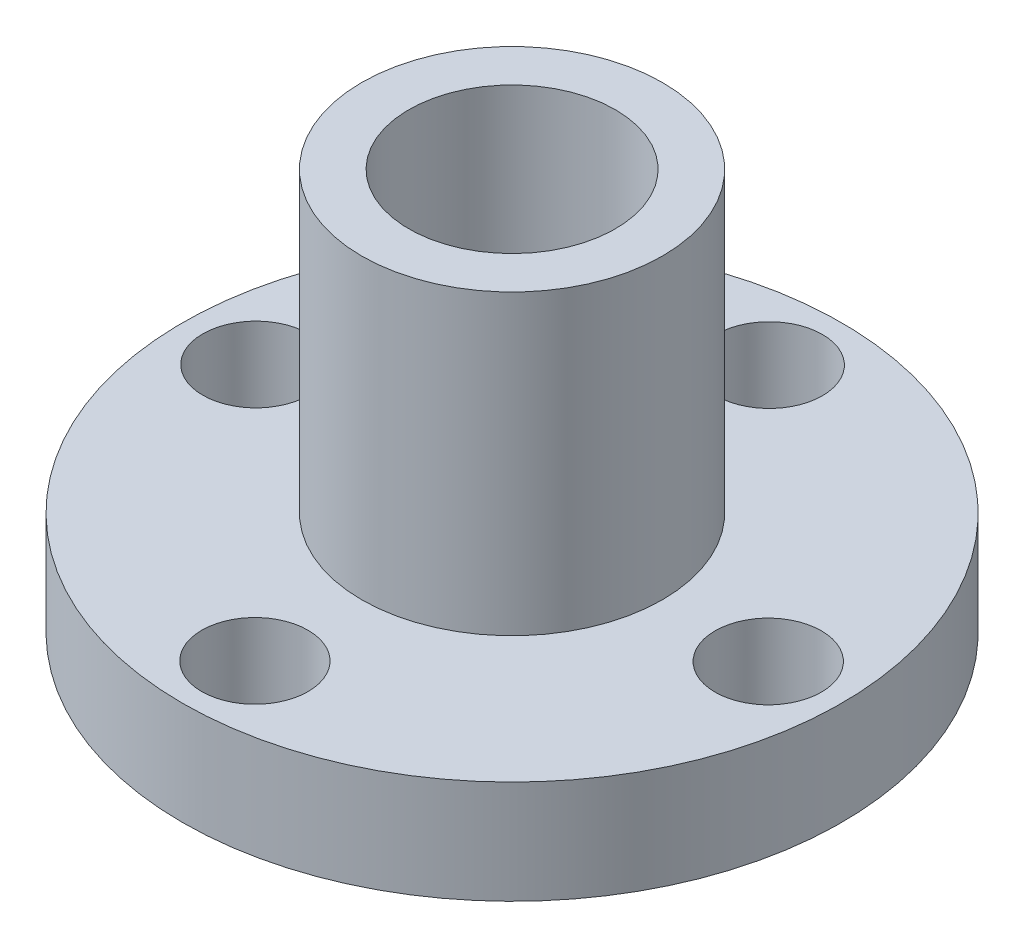
ISO-10303-21;
HEADER;
FILE_DESCRIPTION(('STEP AP214'),'2;1');
FILE_NAME('part.step','',(''),(''),'','','');
FILE_SCHEMA(('AUTOMOTIVE_DESIGN { 1 0 10303 214 1 1 1 1 }'));
ENDSEC;
DATA;
#1=APPLICATION_CONTEXT('core data for automotive mechanical design processes');
#2=APPLICATION_PROTOCOL_DEFINITION('international standard','automotive_design',2000,#1);
#3=PRODUCT_CONTEXT('',#1,'mechanical');
#4=PRODUCT('Part','Part','',(#3));
#5=PRODUCT_RELATED_PRODUCT_CATEGORY('part','',(#4));
#6=PRODUCT_DEFINITION_FORMATION('','',#4);
#7=PRODUCT_DEFINITION_CONTEXT('part definition',#1,'design');
#8=PRODUCT_DEFINITION('design','',#6,#7);
#9=PRODUCT_DEFINITION_SHAPE('','',#8);
#10=(LENGTH_UNIT() NAMED_UNIT(*) SI_UNIT(.MILLI.,.METRE.));
#11=(NAMED_UNIT(*) PLANE_ANGLE_UNIT() SI_UNIT($,.RADIAN.));
#12=(NAMED_UNIT(*) SI_UNIT($,.STERADIAN.) SOLID_ANGLE_UNIT());
#13=UNCERTAINTY_MEASURE_WITH_UNIT(LENGTH_MEASURE(1.E-05),#10,'distance_accuracy_value','');
#14=(GEOMETRIC_REPRESENTATION_CONTEXT(3) GLOBAL_UNCERTAINTY_ASSIGNED_CONTEXT((#13)) GLOBAL_UNIT_ASSIGNED_CONTEXT((#10,
#11,#12)) REPRESENTATION_CONTEXT('',''));
#15=CARTESIAN_POINT('',(0.,0.,0.));
#16=DIRECTION('',(0.,0.,1.));
#17=DIRECTION('',(1.,0.,0.));
#18=AXIS2_PLACEMENT_3D('',#15,#16,#17);
#19=CARTESIAN_POINT('',(0.,14.7,0.));
#20=DIRECTION('',(0.,1.,0.));
#21=DIRECTION('',(0.,0.,1.));
#22=AXIS2_PLACEMENT_3D('',#19,#20,#21);
#23=PLANE('',#22);
#24=CARTESIAN_POINT('',(0.,14.7,0.));
#25=DIRECTION('',(0.,1.,0.));
#26=DIRECTION('',(0.,0.,1.));
#27=AXIS2_PLACEMENT_3D('',#24,#25,#26);
#28=CIRCLE('',#27,4.95);
#29=CARTESIAN_POINT('',(0.,14.7,4.95));
#30=VERTEX_POINT('',#29);
#31=EDGE_CURVE('E62',#30,#30,#28,.T.);
#32=ORIENTED_EDGE('',*,*,#31,.T.);
#33=EDGE_LOOP('',(#32));
#34=FACE_BOUND('',#33,.T.);
#35=CARTESIAN_POINT('',(0.,14.7,0.));
#36=DIRECTION('',(0.,-1.,0.));
#37=DIRECTION('',(0.,0.,-1.));
#38=AXIS2_PLACEMENT_3D('',#35,#36,#37);
#39=CIRCLE('',#38,3.4);
#40=CARTESIAN_POINT('',(0.,14.7,-3.4));
#41=VERTEX_POINT('',#40);
#42=EDGE_CURVE('E75',#41,#41,#39,.T.);
#43=ORIENTED_EDGE('',*,*,#42,.T.);
#44=EDGE_LOOP('',(#43));
#45=FACE_BOUND('',#44,.T.);
#46=ADVANCED_FACE('F45',(#34,#45),#23,.T.);
#47=CARTESIAN_POINT('',(0.,1.5,0.));
#48=DIRECTION('',(0.,-1.,0.));
#49=DIRECTION('',(0.,0.,-1.));
#50=AXIS2_PLACEMENT_3D('',#47,#48,#49);
#51=CYLINDRICAL_SURFACE('',#50,5.);
#52=CARTESIAN_POINT('',(0.,1.5,0.));
#53=DIRECTION('',(0.,1.,0.));
#54=DIRECTION('',(0.,0.,1.));
#55=AXIS2_PLACEMENT_3D('',#52,#53,#54);
#56=CIRCLE('',#55,5.);
#57=CARTESIAN_POINT('',(0.,1.5,5.));
#58=VERTEX_POINT('',#57);
#59=EDGE_CURVE('E54',#58,#58,#56,.T.);
#60=ORIENTED_EDGE('',*,*,#59,.F.);
#61=EDGE_LOOP('',(#60));
#62=FACE_BOUND('',#61,.T.);
#63=CARTESIAN_POINT('',(0.,0.,0.));
#64=DIRECTION('',(0.,1.,0.));
#65=DIRECTION('',(0.,0.,1.));
#66=AXIS2_PLACEMENT_3D('',#63,#64,#65);
#67=CIRCLE('',#66,5.);
#68=CARTESIAN_POINT('',(0.,0.,5.));
#69=VERTEX_POINT('',#68);
#70=EDGE_CURVE('E49',#69,#69,#67,.T.);
#71=ORIENTED_EDGE('',*,*,#70,.T.);
#72=EDGE_LOOP('',(#71));
#73=FACE_BOUND('',#72,.T.);
#74=ADVANCED_FACE('F47',(#62,#73),#51,.T.);
#75=CARTESIAN_POINT('',(0.,0.,0.));
#76=DIRECTION('',(0.,1.,0.));
#77=DIRECTION('',(0.,0.,1.));
#78=AXIS2_PLACEMENT_3D('',#75,#76,#77);
#79=PLANE('',#78);
#80=CARTESIAN_POINT('',(0.,0.,0.));
#81=DIRECTION('',(0.,-1.,0.));
#82=DIRECTION('',(0.,0.,-1.));
#83=AXIS2_PLACEMENT_3D('',#80,#81,#82);
#84=CIRCLE('',#83,4.025);
#85=CARTESIAN_POINT('',(0.,0.,-4.025));
#86=VERTEX_POINT('',#85);
#87=EDGE_CURVE('E85',#86,#86,#84,.T.);
#88=ORIENTED_EDGE('',*,*,#87,.F.);
#89=EDGE_LOOP('',(#88));
#90=FACE_BOUND('',#89,.T.);
#91=ORIENTED_EDGE('',*,*,#70,.F.);
#92=EDGE_LOOP('',(#91));
#93=FACE_BOUND('',#92,.T.);
#94=ADVANCED_FACE('F143',(#90,#93),#79,.F.);
#95=CARTESIAN_POINT('',(0.,4.9,0.));
#96=DIRECTION('',(0.,-1.,0.));
#97=DIRECTION('',(0.,0.,-1.));
#98=AXIS2_PLACEMENT_3D('',#95,#96,#97);
#99=CYLINDRICAL_SURFACE('',#98,10.85);
#100=CARTESIAN_POINT('',(0.,4.9,0.));
#101=DIRECTION('',(0.,1.,0.));
#102=DIRECTION('',(0.,0.,1.));
#103=AXIS2_PLACEMENT_3D('',#100,#101,#102);
#104=CIRCLE('',#103,10.85);
#105=CARTESIAN_POINT('',(0.,4.9,10.85));
#106=VERTEX_POINT('',#105);
#107=EDGE_CURVE('E64',#106,#106,#104,.T.);
#108=ORIENTED_EDGE('',*,*,#107,.F.);
#109=EDGE_LOOP('',(#108));
#110=FACE_BOUND('',#109,.T.);
#111=CARTESIAN_POINT('',(0.,1.5,0.));
#112=DIRECTION('',(0.,1.,0.));
#113=DIRECTION('',(0.,0.,1.));
#114=AXIS2_PLACEMENT_3D('',#111,#112,#113);
#115=CIRCLE('',#114,10.85);
#116=CARTESIAN_POINT('',(0.,1.5,10.85));
#117=VERTEX_POINT('',#116);
#118=EDGE_CURVE('E68',#117,#117,#115,.T.);
#119=ORIENTED_EDGE('',*,*,#118,.T.);
#120=EDGE_LOOP('',(#119));
#121=FACE_BOUND('',#120,.T.);
#122=ADVANCED_FACE('F149',(#110,#121),#99,.T.);
#123=CARTESIAN_POINT('',(0.,4.9,0.));
#124=DIRECTION('',(0.,1.,0.));
#125=DIRECTION('',(0.,0.,1.));
#126=AXIS2_PLACEMENT_3D('',#123,#124,#125);
#127=PLANE('',#126);
#128=CARTESIAN_POINT('',(-0.0164164222524315,4.9,8.44981251217976));
#129=DIRECTION('',(0.,1.,0.));
#130=DIRECTION('',(0.,0.,1.));
#131=AXIS2_PLACEMENT_3D('',#128,#129,#130);
#132=CIRCLE('',#131,1.75);
#133=CARTESIAN_POINT('',(-0.0164164222524315,4.9,10.1998125121798));
#134=VERTEX_POINT('',#133);
#135=EDGE_CURVE('E91',#134,#134,#132,.T.);
#136=ORIENTED_EDGE('',*,*,#135,.F.);
#137=EDGE_LOOP('',(#136));
#138=FACE_BOUND('',#137,.T.);
#139=CARTESIAN_POINT('',(8.44981251217976,4.9,0.016416422252402));
#140=DIRECTION('',(0.,1.,0.));
#141=DIRECTION('',(0.,0.,1.));
#142=AXIS2_PLACEMENT_3D('',#139,#140,#141);
#143=CIRCLE('',#142,1.75);
#144=CARTESIAN_POINT('',(8.44981251217976,4.9,1.7664164222524));
#145=VERTEX_POINT('',#144);
#146=EDGE_CURVE('E95',#145,#145,#143,.T.);
#147=ORIENTED_EDGE('',*,*,#146,.F.);
#148=EDGE_LOOP('',(#147));
#149=FACE_BOUND('',#148,.T.);
#150=CARTESIAN_POINT('',(0.0164164222523725,4.9,-8.44981251217976));
#151=DIRECTION('',(0.,1.,0.));
#152=DIRECTION('',(0.,0.,1.));
#153=AXIS2_PLACEMENT_3D('',#150,#151,#152);
#154=CIRCLE('',#153,1.75);
#155=CARTESIAN_POINT('',(0.0164164222523725,4.9,-6.69981251217976));
#156=VERTEX_POINT('',#155);
#157=EDGE_CURVE('E99',#156,#156,#154,.T.);
#158=ORIENTED_EDGE('',*,*,#157,.F.);
#159=EDGE_LOOP('',(#158));
#160=FACE_BOUND('',#159,.T.);
#161=CARTESIAN_POINT('',(-8.44981251217976,4.9,-0.016416422252343));
#162=DIRECTION('',(0.,1.,0.));
#163=DIRECTION('',(0.,0.,1.));
#164=AXIS2_PLACEMENT_3D('',#161,#162,#163);
#165=CIRCLE('',#164,1.75);
#166=CARTESIAN_POINT('',(-8.44981251217976,4.9,1.73358357774766));
#167=VERTEX_POINT('',#166);
#168=EDGE_CURVE('E103',#167,#167,#165,.T.);
#169=ORIENTED_EDGE('',*,*,#168,.F.);
#170=EDGE_LOOP('',(#169));
#171=FACE_BOUND('',#170,.T.);
#172=CARTESIAN_POINT('',(0.,4.9,0.));
#173=DIRECTION('',(0.,1.,0.));
#174=DIRECTION('',(0.,0.,1.));
#175=AXIS2_PLACEMENT_3D('',#172,#173,#174);
#176=CIRCLE('',#175,4.95);
#177=CARTESIAN_POINT('',(0.,4.9,4.95));
#178=VERTEX_POINT('',#177);
#179=EDGE_CURVE('E10',#178,#178,#176,.T.);
#180=ORIENTED_EDGE('',*,*,#179,.F.);
#181=EDGE_LOOP('',(#180));
#182=FACE_BOUND('',#181,.T.);
#183=ORIENTED_EDGE('',*,*,#107,.T.);
#184=EDGE_LOOP('',(#183));
#185=FACE_BOUND('',#184,.T.);
#186=ADVANCED_FACE('F130',(#138,#149,#160,#171,#182,#185),#127,.T.);
#187=CARTESIAN_POINT('',(0.,1.5,0.));
#188=DIRECTION('',(0.,1.,0.));
#189=DIRECTION('',(0.,0.,1.));
#190=AXIS2_PLACEMENT_3D('',#187,#188,#189);
#191=PLANE('',#190);
#192=CARTESIAN_POINT('',(-0.0164164222524315,1.5,8.44981251217976));
#193=DIRECTION('',(0.,-1.,0.));
#194=DIRECTION('',(0.,0.,-1.));
#195=AXIS2_PLACEMENT_3D('',#192,#193,#194);
#196=CIRCLE('',#195,1.75);
#197=CARTESIAN_POINT('',(-0.0164164222524315,1.5,6.69981251217976));
#198=VERTEX_POINT('',#197);
#199=EDGE_CURVE('E107',#198,#198,#196,.T.);
#200=ORIENTED_EDGE('',*,*,#199,.F.);
#201=EDGE_LOOP('',(#200));
#202=FACE_BOUND('',#201,.T.);
#203=CARTESIAN_POINT('',(8.44981251217976,1.5,0.016416422252402));
#204=DIRECTION('',(0.,-1.,0.));
#205=DIRECTION('',(0.,0.,-1.));
#206=AXIS2_PLACEMENT_3D('',#203,#204,#205);
#207=CIRCLE('',#206,1.75);
#208=CARTESIAN_POINT('',(8.44981251217976,1.5,-1.7335835777476));
#209=VERTEX_POINT('',#208);
#210=EDGE_CURVE('E116',#209,#209,#207,.T.);
#211=ORIENTED_EDGE('',*,*,#210,.F.);
#212=EDGE_LOOP('',(#211));
#213=FACE_BOUND('',#212,.T.);
#214=CARTESIAN_POINT('',(0.0164164222523725,1.5,-8.44981251217976));
#215=DIRECTION('',(0.,-1.,0.));
#216=DIRECTION('',(0.,0.,-1.));
#217=AXIS2_PLACEMENT_3D('',#214,#215,#216);
#218=CIRCLE('',#217,1.75);
#219=CARTESIAN_POINT('',(0.0164164222523725,1.5,-10.1998125121798));
#220=VERTEX_POINT('',#219);
#221=EDGE_CURVE('E112',#220,#220,#218,.T.);
#222=ORIENTED_EDGE('',*,*,#221,.F.);
#223=EDGE_LOOP('',(#222));
#224=FACE_BOUND('',#223,.T.);
#225=CARTESIAN_POINT('',(-8.44981251217976,1.5,-0.016416422252343));
#226=DIRECTION('',(0.,-1.,0.));
#227=DIRECTION('',(0.,0.,-1.));
#228=AXIS2_PLACEMENT_3D('',#225,#226,#227);
#229=CIRCLE('',#228,1.75);
#230=CARTESIAN_POINT('',(-8.44981251217976,1.5,-1.76641642225234));
#231=VERTEX_POINT('',#230);
#232=EDGE_CURVE('E108',#231,#231,#229,.T.);
#233=ORIENTED_EDGE('',*,*,#232,.F.);
#234=EDGE_LOOP('',(#233));
#235=FACE_BOUND('',#234,.T.);
#236=ORIENTED_EDGE('',*,*,#59,.T.);
#237=EDGE_LOOP('',(#236));
#238=FACE_BOUND('',#237,.T.);
#239=ORIENTED_EDGE('',*,*,#118,.F.);
#240=EDGE_LOOP('',(#239));
#241=FACE_BOUND('',#240,.T.);
#242=ADVANCED_FACE('F126',(#202,#213,#224,#235,#238,#241),#191,.F.);
#243=CARTESIAN_POINT('',(0.,14.7,0.));
#244=DIRECTION('',(0.,-1.,0.));
#245=DIRECTION('',(0.,0.,-1.));
#246=AXIS2_PLACEMENT_3D('',#243,#244,#245);
#247=CYLINDRICAL_SURFACE('',#246,4.95);
#248=ORIENTED_EDGE('',*,*,#31,.F.);
#249=EDGE_LOOP('',(#248));
#250=FACE_BOUND('',#249,.T.);
#251=ORIENTED_EDGE('',*,*,#179,.T.);
#252=EDGE_LOOP('',(#251));
#253=FACE_BOUND('',#252,.T.);
#254=ADVANCED_FACE('F129',(#250,#253),#247,.T.);
#255=CARTESIAN_POINT('',(0.,0.,0.));
#256=DIRECTION('',(0.,-1.,0.));
#257=DIRECTION('',(0.,0.,-1.));
#258=AXIS2_PLACEMENT_3D('',#255,#256,#257);
#259=CYLINDRICAL_SURFACE('',#258,3.4);
#260=ORIENTED_EDGE('',*,*,#42,.F.);
#261=EDGE_LOOP('',(#260));
#262=FACE_BOUND('',#261,.T.);
#263=CARTESIAN_POINT('',(0.,0.625000000000001,0.));
#264=DIRECTION('',(0.,-1.,0.));
#265=DIRECTION('',(0.,0.,-1.));
#266=AXIS2_PLACEMENT_3D('',#263,#264,#265);
#267=CIRCLE('',#266,3.4);
#268=CARTESIAN_POINT('',(0.,0.625000000000001,-3.4));
#269=VERTEX_POINT('',#268);
#270=EDGE_CURVE('E80',#269,#269,#267,.T.);
#271=ORIENTED_EDGE('',*,*,#270,.T.);
#272=EDGE_LOOP('',(#271));
#273=FACE_BOUND('',#272,.T.);
#274=ADVANCED_FACE('F163',(#262,#273),#259,.F.);
#275=CARTESIAN_POINT('',(0.,0.,0.));
#276=DIRECTION('',(0.,-1.,0.));
#277=DIRECTION('',(0.,0.,-1.));
#278=AXIS2_PLACEMENT_3D('',#275,#276,#277);
#279=CONICAL_SURFACE('',#278,4.025,0.78539816339745);
#280=ORIENTED_EDGE('',*,*,#270,.F.);
#281=EDGE_LOOP('',(#280));
#282=FACE_BOUND('',#281,.T.);
#283=ORIENTED_EDGE('',*,*,#87,.T.);
#284=EDGE_LOOP('',(#283));
#285=FACE_BOUND('',#284,.T.);
#286=ADVANCED_FACE('F187',(#282,#285),#279,.F.);
#287=CARTESIAN_POINT('',(-8.44981251217976,14.7,-0.016416422252343));
#288=DIRECTION('',(0.,-1.,0.));
#289=DIRECTION('',(0.,0.,-1.));
#290=AXIS2_PLACEMENT_3D('',#287,#288,#289);
#291=CYLINDRICAL_SURFACE('',#290,1.75);
#292=ORIENTED_EDGE('',*,*,#168,.T.);
#293=EDGE_LOOP('',(#292));
#294=FACE_BOUND('',#293,.T.);
#295=ORIENTED_EDGE('',*,*,#232,.T.);
#296=EDGE_LOOP('',(#295));
#297=FACE_BOUND('',#296,.T.);
#298=ADVANCED_FACE('F183',(#294,#297),#291,.F.);
#299=CARTESIAN_POINT('',(0.0164164222523725,14.7,-8.44981251217976));
#300=DIRECTION('',(0.,-1.,0.));
#301=DIRECTION('',(0.,0.,-1.));
#302=AXIS2_PLACEMENT_3D('',#299,#300,#301);
#303=CYLINDRICAL_SURFACE('',#302,1.75);
#304=ORIENTED_EDGE('',*,*,#157,.T.);
#305=EDGE_LOOP('',(#304));
#306=FACE_BOUND('',#305,.T.);
#307=ORIENTED_EDGE('',*,*,#221,.T.);
#308=EDGE_LOOP('',(#307));
#309=FACE_BOUND('',#308,.T.);
#310=ADVANCED_FACE('F186',(#306,#309),#303,.F.);
#311=CARTESIAN_POINT('',(8.44981251217976,14.7,0.016416422252402));
#312=DIRECTION('',(0.,-1.,0.));
#313=DIRECTION('',(0.,0.,-1.));
#314=AXIS2_PLACEMENT_3D('',#311,#312,#313);
#315=CYLINDRICAL_SURFACE('',#314,1.75);
#316=ORIENTED_EDGE('',*,*,#146,.T.);
#317=EDGE_LOOP('',(#316));
#318=FACE_BOUND('',#317,.T.);
#319=ORIENTED_EDGE('',*,*,#210,.T.);
#320=EDGE_LOOP('',(#319));
#321=FACE_BOUND('',#320,.T.);
#322=ADVANCED_FACE('F193',(#318,#321),#315,.F.);
#323=CARTESIAN_POINT('',(-0.0164164222524315,14.7,8.44981251217976));
#324=DIRECTION('',(0.,-1.,0.));
#325=DIRECTION('',(0.,0.,-1.));
#326=AXIS2_PLACEMENT_3D('',#323,#324,#325);
#327=CYLINDRICAL_SURFACE('',#326,1.75);
#328=ORIENTED_EDGE('',*,*,#135,.T.);
#329=EDGE_LOOP('',(#328));
#330=FACE_BOUND('',#329,.T.);
#331=ORIENTED_EDGE('',*,*,#199,.T.);
#332=EDGE_LOOP('',(#331));
#333=FACE_BOUND('',#332,.T.);
#334=ADVANCED_FACE('F124',(#330,#333),#327,.F.);
#335=CLOSED_SHELL('',(#46,#74,#94,#122,#186,#242,#254,#274,#286,#298,#310,#322,#334));
#336=MANIFOLD_SOLID_BREP('B2',#335);
#337=ADVANCED_BREP_SHAPE_REPRESENTATION('',(#18,#336),#14);
#338=SHAPE_DEFINITION_REPRESENTATION(#9,#337);
ENDSEC;
END-ISO-10303-21;
